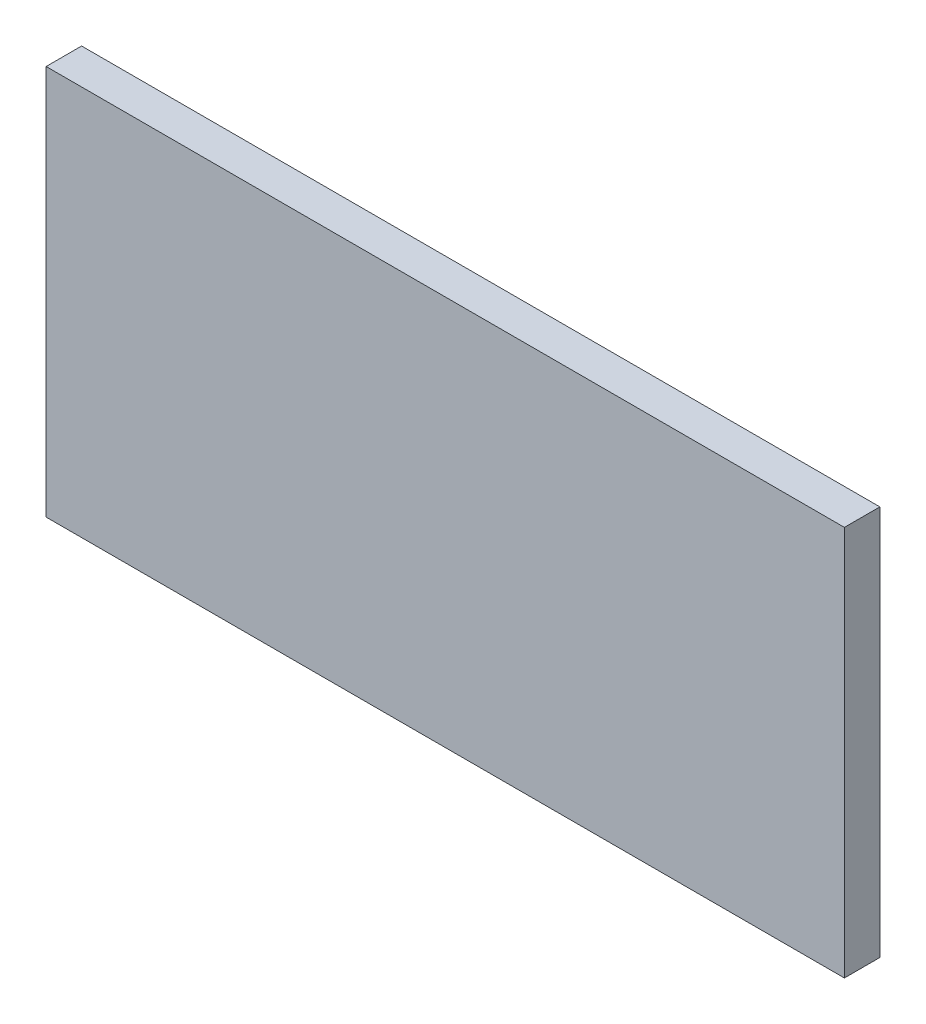
ISO-10303-21;
HEADER;
FILE_DESCRIPTION(('STEP AP214'),'2;1');
FILE_NAME('part.step','',(''),(''),'','','');
FILE_SCHEMA(('AUTOMOTIVE_DESIGN { 1 0 10303 214 1 1 1 1 }'));
ENDSEC;
DATA;
#1=APPLICATION_CONTEXT('core data for automotive mechanical design processes');
#2=APPLICATION_PROTOCOL_DEFINITION('international standard','automotive_design',2000,#1);
#3=PRODUCT_CONTEXT('',#1,'mechanical');
#4=PRODUCT('Part','Part','',(#3));
#5=PRODUCT_RELATED_PRODUCT_CATEGORY('part','',(#4));
#6=PRODUCT_DEFINITION_FORMATION('','',#4);
#7=PRODUCT_DEFINITION_CONTEXT('part definition',#1,'design');
#8=PRODUCT_DEFINITION('design','',#6,#7);
#9=PRODUCT_DEFINITION_SHAPE('','',#8);
#10=(LENGTH_UNIT() NAMED_UNIT(*) SI_UNIT(.MILLI.,.METRE.));
#11=(NAMED_UNIT(*) PLANE_ANGLE_UNIT() SI_UNIT($,.RADIAN.));
#12=(NAMED_UNIT(*) SI_UNIT($,.STERADIAN.) SOLID_ANGLE_UNIT());
#13=UNCERTAINTY_MEASURE_WITH_UNIT(LENGTH_MEASURE(1.E-05),#10,'distance_accuracy_value','');
#14=(GEOMETRIC_REPRESENTATION_CONTEXT(3) GLOBAL_UNCERTAINTY_ASSIGNED_CONTEXT((#13)) GLOBAL_UNIT_ASSIGNED_CONTEXT((#10,
#11,#12)) REPRESENTATION_CONTEXT('',''));
#15=CARTESIAN_POINT('',(0.,0.,0.));
#16=DIRECTION('',(0.,0.,1.));
#17=DIRECTION('',(1.,0.,0.));
#18=AXIS2_PLACEMENT_3D('',#15,#16,#17);
#19=CARTESIAN_POINT('',(0.,0.,0.));
#20=DIRECTION('',(0.,0.,1.));
#21=DIRECTION('',(1.,0.,0.));
#22=AXIS2_PLACEMENT_3D('',#19,#20,#21);
#23=PLANE('',#22);
#24=DIRECTION('',(1.,0.,0.));
#25=VECTOR('',#24,1.);
#26=CARTESIAN_POINT('',(1.125,0.55,0.));
#27=LINE('',#26,#25);
#28=CARTESIAN_POINT('',(1.125,0.55,0.));
#29=VERTEX_POINT('',#28);
#30=CARTESIAN_POINT('',(-1.125,0.55,0.));
#31=VERTEX_POINT('',#30);
#32=EDGE_CURVE('E79',#29,#31,#27,.F.);
#33=ORIENTED_EDGE('',*,*,#32,.F.);
#34=DIRECTION('',(0.,1.,0.));
#35=VECTOR('',#34,1.);
#36=CARTESIAN_POINT('',(1.125,-0.55,0.));
#37=LINE('',#36,#35);
#38=CARTESIAN_POINT('',(1.125,-0.55,0.));
#39=VERTEX_POINT('',#38);
#40=EDGE_CURVE('E55',#39,#29,#37,.T.);
#41=ORIENTED_EDGE('',*,*,#40,.F.);
#42=DIRECTION('',(1.,0.,0.));
#43=VECTOR('',#42,1.);
#44=CARTESIAN_POINT('',(-1.125,-0.55,0.));
#45=LINE('',#44,#43);
#46=CARTESIAN_POINT('',(-1.125,-0.55,0.));
#47=VERTEX_POINT('',#46);
#48=EDGE_CURVE('E57',#47,#39,#45,.T.);
#49=ORIENTED_EDGE('',*,*,#48,.F.);
#50=DIRECTION('',(0.,1.,0.));
#51=VECTOR('',#50,1.);
#52=CARTESIAN_POINT('',(-1.125,0.55,0.));
#53=LINE('',#52,#51);
#54=EDGE_CURVE('E20',#31,#47,#53,.F.);
#55=ORIENTED_EDGE('',*,*,#54,.F.);
#56=EDGE_LOOP('',(#33,#41,#49,#55));
#57=FACE_BOUND('',#56,.T.);
#58=ADVANCED_FACE('F17',(#57),#23,.F.);
#59=CARTESIAN_POINT('',(-1.125,0.55,0.));
#60=DIRECTION('',(-1.,0.,0.));
#61=DIRECTION('',(0.,0.,1.));
#62=AXIS2_PLACEMENT_3D('',#59,#60,#61);
#63=PLANE('',#62);
#64=DIRECTION('',(0.,1.,0.));
#65=VECTOR('',#64,1.);
#66=CARTESIAN_POINT('',(-1.125,0.,0.1));
#67=LINE('',#66,#65);
#68=CARTESIAN_POINT('',(-1.125,0.55,0.1));
#69=VERTEX_POINT('',#68);
#70=CARTESIAN_POINT('',(-1.125,-0.55,0.1));
#71=VERTEX_POINT('',#70);
#72=EDGE_CURVE('E83',#69,#71,#67,.F.);
#73=ORIENTED_EDGE('',*,*,#72,.F.);
#74=DIRECTION('',(0.,0.,1.));
#75=VECTOR('',#74,1.);
#76=CARTESIAN_POINT('',(-1.125,0.55,0.));
#77=LINE('',#76,#75);
#78=EDGE_CURVE('E68',#31,#69,#77,.T.);
#79=ORIENTED_EDGE('',*,*,#78,.F.);
#80=ORIENTED_EDGE('',*,*,#54,.T.);
#81=DIRECTION('',(0.,0.,-1.));
#82=VECTOR('',#81,1.);
#83=CARTESIAN_POINT('',(-1.125,-0.55,0.));
#84=LINE('',#83,#82);
#85=EDGE_CURVE('E63',#71,#47,#84,.T.);
#86=ORIENTED_EDGE('',*,*,#85,.F.);
#87=EDGE_LOOP('',(#73,#79,#80,#86));
#88=FACE_BOUND('',#87,.T.);
#89=ADVANCED_FACE('F65',(#88),#63,.T.);
#90=CARTESIAN_POINT('',(-1.125,-0.55,0.));
#91=DIRECTION('',(0.,-1.,0.));
#92=DIRECTION('',(0.,0.,-1.));
#93=AXIS2_PLACEMENT_3D('',#90,#91,#92);
#94=PLANE('',#93);
#95=DIRECTION('',(1.,0.,0.));
#96=VECTOR('',#95,1.);
#97=CARTESIAN_POINT('',(0.,-0.55,0.1));
#98=LINE('',#97,#96);
#99=CARTESIAN_POINT('',(1.125,-0.55,0.1));
#100=VERTEX_POINT('',#99);
#101=EDGE_CURVE('E72',#71,#100,#98,.T.);
#102=ORIENTED_EDGE('',*,*,#101,.F.);
#103=ORIENTED_EDGE('',*,*,#85,.T.);
#104=ORIENTED_EDGE('',*,*,#48,.T.);
#105=DIRECTION('',(0.,0.,-1.));
#106=VECTOR('',#105,1.);
#107=CARTESIAN_POINT('',(1.125,-0.55,0.));
#108=LINE('',#107,#106);
#109=EDGE_CURVE('E75',#100,#39,#108,.T.);
#110=ORIENTED_EDGE('',*,*,#109,.F.);
#111=EDGE_LOOP('',(#102,#103,#104,#110));
#112=FACE_BOUND('',#111,.T.);
#113=ADVANCED_FACE('F70',(#112),#94,.T.);
#114=CARTESIAN_POINT('',(1.125,-0.55,0.));
#115=DIRECTION('',(1.,0.,0.));
#116=DIRECTION('',(0.,0.,-1.));
#117=AXIS2_PLACEMENT_3D('',#114,#115,#116);
#118=PLANE('',#117);
#119=DIRECTION('',(0.,1.,0.));
#120=VECTOR('',#119,1.);
#121=CARTESIAN_POINT('',(1.125,0.,0.1));
#122=LINE('',#121,#120);
#123=CARTESIAN_POINT('',(1.125,0.55,0.1));
#124=VERTEX_POINT('',#123);
#125=EDGE_CURVE('E26',#100,#124,#122,.T.);
#126=ORIENTED_EDGE('',*,*,#125,.F.);
#127=ORIENTED_EDGE('',*,*,#109,.T.);
#128=ORIENTED_EDGE('',*,*,#40,.T.);
#129=DIRECTION('',(0.,0.,1.));
#130=VECTOR('',#129,1.);
#131=CARTESIAN_POINT('',(1.125,0.55,0.));
#132=LINE('',#131,#130);
#133=EDGE_CURVE('E35',#124,#29,#132,.F.);
#134=ORIENTED_EDGE('',*,*,#133,.F.);
#135=EDGE_LOOP('',(#126,#127,#128,#134));
#136=FACE_BOUND('',#135,.T.);
#137=ADVANCED_FACE('F89',(#136),#118,.T.);
#138=CARTESIAN_POINT('',(1.125,0.55,0.));
#139=DIRECTION('',(0.,1.,0.));
#140=DIRECTION('',(0.,0.,1.));
#141=AXIS2_PLACEMENT_3D('',#138,#139,#140);
#142=PLANE('',#141);
#143=DIRECTION('',(1.,0.,0.));
#144=VECTOR('',#143,1.);
#145=CARTESIAN_POINT('',(0.,0.55,0.1));
#146=LINE('',#145,#144);
#147=EDGE_CURVE('E11',#124,#69,#146,.F.);
#148=ORIENTED_EDGE('',*,*,#147,.F.);
#149=ORIENTED_EDGE('',*,*,#133,.T.);
#150=ORIENTED_EDGE('',*,*,#32,.T.);
#151=ORIENTED_EDGE('',*,*,#78,.T.);
#152=EDGE_LOOP('',(#148,#149,#150,#151));
#153=FACE_BOUND('',#152,.T.);
#154=ADVANCED_FACE('F91',(#153),#142,.T.);
#155=CARTESIAN_POINT('',(0.,0.,0.1));
#156=DIRECTION('',(0.,0.,1.));
#157=DIRECTION('',(1.,0.,0.));
#158=AXIS2_PLACEMENT_3D('',#155,#156,#157);
#159=PLANE('',#158);
#160=ORIENTED_EDGE('',*,*,#125,.T.);
#161=ORIENTED_EDGE('',*,*,#147,.T.);
#162=ORIENTED_EDGE('',*,*,#72,.T.);
#163=ORIENTED_EDGE('',*,*,#101,.T.);
#164=EDGE_LOOP('',(#160,#161,#162,#163));
#165=FACE_BOUND('',#164,.T.);
#166=ADVANCED_FACE('F88',(#165),#159,.T.);
#167=CLOSED_SHELL('',(#58,#89,#113,#137,#154,#166));
#168=MANIFOLD_SOLID_BREP('B1',#167);
#169=ADVANCED_BREP_SHAPE_REPRESENTATION('',(#18,#168),#14);
#170=SHAPE_DEFINITION_REPRESENTATION(#9,#169);
ENDSEC;
END-ISO-10303-21;
